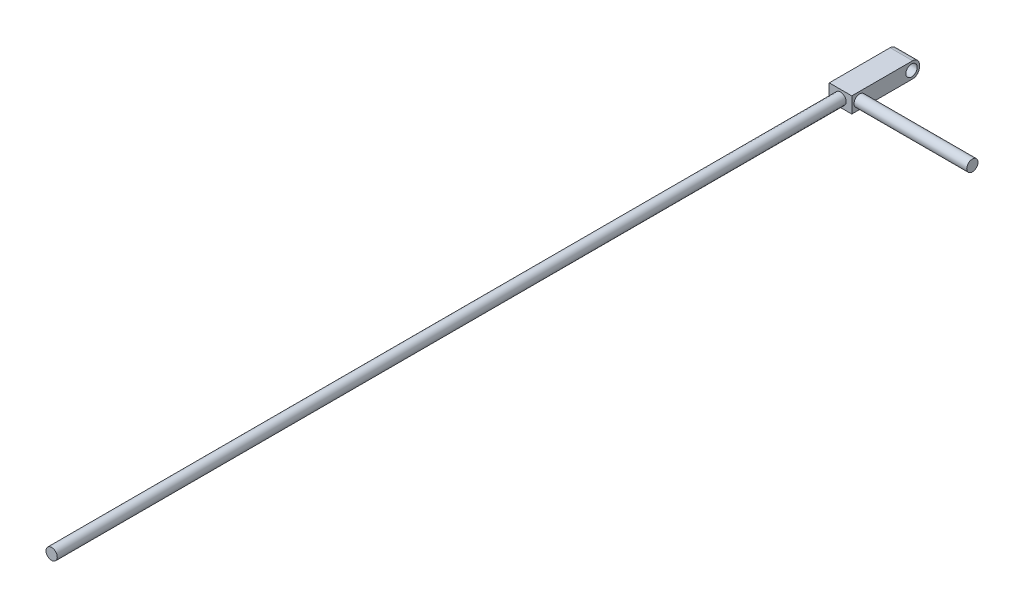
ISO-10303-21;
HEADER;
FILE_DESCRIPTION(('STEP AP214'),'2;1');
FILE_NAME('part.step','',(''),(''),'','','');
FILE_SCHEMA(('AUTOMOTIVE_DESIGN { 1 0 10303 214 1 1 1 1 }'));
ENDSEC;
DATA;
#1=APPLICATION_CONTEXT('core data for automotive mechanical design processes');
#2=APPLICATION_PROTOCOL_DEFINITION('international standard','automotive_design',2000,#1);
#3=PRODUCT_CONTEXT('',#1,'mechanical');
#4=PRODUCT('Part','Part','',(#3));
#5=PRODUCT_RELATED_PRODUCT_CATEGORY('part','',(#4));
#6=PRODUCT_DEFINITION_FORMATION('','',#4);
#7=PRODUCT_DEFINITION_CONTEXT('part definition',#1,'design');
#8=PRODUCT_DEFINITION('design','',#6,#7);
#9=PRODUCT_DEFINITION_SHAPE('','',#8);
#10=(LENGTH_UNIT() NAMED_UNIT(*) SI_UNIT(.MILLI.,.METRE.));
#11=(NAMED_UNIT(*) PLANE_ANGLE_UNIT() SI_UNIT($,.RADIAN.));
#12=(NAMED_UNIT(*) SI_UNIT($,.STERADIAN.) SOLID_ANGLE_UNIT());
#13=UNCERTAINTY_MEASURE_WITH_UNIT(LENGTH_MEASURE(1.E-05),#10,'distance_accuracy_value','');
#14=(GEOMETRIC_REPRESENTATION_CONTEXT(3) GLOBAL_UNCERTAINTY_ASSIGNED_CONTEXT((#13)) GLOBAL_UNIT_ASSIGNED_CONTEXT((#10,
#11,#12)) REPRESENTATION_CONTEXT('',''));
#15=CARTESIAN_POINT('',(0.,0.,0.));
#16=DIRECTION('',(0.,0.,1.));
#17=DIRECTION('',(1.,0.,0.));
#18=AXIS2_PLACEMENT_3D('',#15,#16,#17);
#19=CARTESIAN_POINT('',(5.,3.5,30.));
#20=DIRECTION('',(-1.,0.,0.));
#21=DIRECTION('',(0.,0.,1.));
#22=AXIS2_PLACEMENT_3D('',#19,#20,#21);
#23=PLANE('',#22);
#24=CARTESIAN_POINT('',(5.,0.,26.5));
#25=DIRECTION('',(-1.,0.,0.));
#26=DIRECTION('',(0.,0.,1.));
#27=AXIS2_PLACEMENT_3D('',#24,#25,#26);
#28=CIRCLE('',#27,2.5);
#29=CARTESIAN_POINT('',(5.,0.,29.));
#30=VERTEX_POINT('',#29);
#31=EDGE_CURVE('E113',#30,#30,#28,.F.);
#32=ORIENTED_EDGE('',*,*,#31,.F.);
#33=EDGE_LOOP('',(#32));
#34=FACE_BOUND('',#33,.T.);
#35=CARTESIAN_POINT('',(5.,0.,3.5));
#36=DIRECTION('',(1.,0.,0.));
#37=DIRECTION('',(0.,1.,0.));
#38=AXIS2_PLACEMENT_3D('',#35,#36,#37);
#39=CIRCLE('',#38,2.5);
#40=CARTESIAN_POINT('',(5.,2.5,3.5));
#41=VERTEX_POINT('',#40);
#42=EDGE_CURVE('E125',#41,#41,#39,.T.);
#43=ORIENTED_EDGE('',*,*,#42,.F.);
#44=EDGE_LOOP('',(#43));
#45=FACE_BOUND('',#44,.T.);
#46=DIRECTION('',(0.,0.,-1.));
#47=VECTOR('',#46,1.);
#48=CARTESIAN_POINT('',(5.,-3.5,30.));
#49=LINE('',#48,#47);
#50=CARTESIAN_POINT('',(5.,-3.5,30.));
#51=VERTEX_POINT('',#50);
#52=CARTESIAN_POINT('',(5.,-3.5,3.));
#53=VERTEX_POINT('',#52);
#54=EDGE_CURVE('E142',#51,#53,#49,.T.);
#55=ORIENTED_EDGE('',*,*,#54,.T.);
#56=CARTESIAN_POINT('',(5.,-0.499999999999999,3.));
#57=DIRECTION('',(-1.,0.,0.));
#58=DIRECTION('',(0.,0.,1.));
#59=AXIS2_PLACEMENT_3D('',#56,#57,#58);
#60=CIRCLE('',#59,3.);
#61=CARTESIAN_POINT('',(5.,-0.499999999999997,0.));
#62=VERTEX_POINT('',#61);
#63=EDGE_CURVE('E130',#53,#62,#60,.F.);
#64=ORIENTED_EDGE('',*,*,#63,.T.);
#65=DIRECTION('',(0.,1.,0.));
#66=VECTOR('',#65,1.);
#67=CARTESIAN_POINT('',(5.,3.5,0.));
#68=LINE('',#67,#66);
#69=CARTESIAN_POINT('',(5.,0.500000000000001,0.));
#70=VERTEX_POINT('',#69);
#71=EDGE_CURVE('E124',#62,#70,#68,.T.);
#72=ORIENTED_EDGE('',*,*,#71,.T.);
#73=CARTESIAN_POINT('',(5.,0.5,3.));
#74=DIRECTION('',(-1.,0.,0.));
#75=DIRECTION('',(0.,0.,1.));
#76=AXIS2_PLACEMENT_3D('',#73,#74,#75);
#77=CIRCLE('',#76,3.);
#78=CARTESIAN_POINT('',(5.,3.5,3.));
#79=VERTEX_POINT('',#78);
#80=EDGE_CURVE('E112',#70,#79,#77,.F.);
#81=ORIENTED_EDGE('',*,*,#80,.T.);
#82=DIRECTION('',(0.,0.,-1.));
#83=VECTOR('',#82,1.);
#84=CARTESIAN_POINT('',(5.,3.5,30.));
#85=LINE('',#84,#83);
#86=CARTESIAN_POINT('',(5.,3.5,30.));
#87=VERTEX_POINT('',#86);
#88=EDGE_CURVE('E93',#87,#79,#85,.T.);
#89=ORIENTED_EDGE('',*,*,#88,.F.);
#90=DIRECTION('',(0.,1.,0.));
#91=VECTOR('',#90,1.);
#92=CARTESIAN_POINT('',(5.,3.5,30.));
#93=LINE('',#92,#91);
#94=EDGE_CURVE('E99',#51,#87,#93,.T.);
#95=ORIENTED_EDGE('',*,*,#94,.F.);
#96=EDGE_LOOP('',(#55,#64,#72,#81,#89,#95));
#97=FACE_BOUND('',#96,.T.);
#98=ADVANCED_FACE('F32',(#34,#45,#97),#23,.F.);
#99=CARTESIAN_POINT('',(-5.,3.5,30.));
#100=DIRECTION('',(0.,-1.,0.));
#101=DIRECTION('',(1.,0.,0.));
#102=AXIS2_PLACEMENT_3D('',#99,#100,#101);
#103=PLANE('',#102);
#104=ORIENTED_EDGE('',*,*,#88,.T.);
#105=DIRECTION('',(-1.,0.,0.));
#106=VECTOR('',#105,1.);
#107=CARTESIAN_POINT('',(-5.,3.5,3.));
#108=LINE('',#107,#106);
#109=CARTESIAN_POINT('',(-5.,3.5,3.));
#110=VERTEX_POINT('',#109);
#111=EDGE_CURVE('E36',#79,#110,#108,.T.);
#112=ORIENTED_EDGE('',*,*,#111,.T.);
#113=DIRECTION('',(0.,0.,-1.));
#114=VECTOR('',#113,1.);
#115=CARTESIAN_POINT('',(-5.,3.5,30.));
#116=LINE('',#115,#114);
#117=CARTESIAN_POINT('',(-5.,3.5,30.));
#118=VERTEX_POINT('',#117);
#119=EDGE_CURVE('E95',#118,#110,#116,.T.);
#120=ORIENTED_EDGE('',*,*,#119,.F.);
#121=DIRECTION('',(-1.,0.,0.));
#122=VECTOR('',#121,1.);
#123=CARTESIAN_POINT('',(-5.,3.5,30.));
#124=LINE('',#123,#122);
#125=EDGE_CURVE('E89',#87,#118,#124,.T.);
#126=ORIENTED_EDGE('',*,*,#125,.F.);
#127=EDGE_LOOP('',(#104,#112,#120,#126));
#128=FACE_BOUND('',#127,.T.);
#129=ADVANCED_FACE('F91',(#128),#103,.F.);
#130=CARTESIAN_POINT('',(-5.,3.5,30.));
#131=DIRECTION('',(1.,0.,0.));
#132=DIRECTION('',(0.,0.,-1.));
#133=AXIS2_PLACEMENT_3D('',#130,#131,#132);
#134=PLANE('',#133);
#135=CARTESIAN_POINT('',(-5.,0.,3.5));
#136=DIRECTION('',(1.,0.,0.));
#137=DIRECTION('',(0.,0.,-1.));
#138=AXIS2_PLACEMENT_3D('',#135,#136,#137);
#139=CIRCLE('',#138,2.5);
#140=CARTESIAN_POINT('',(-5.,0.,0.999999999999999));
#141=VERTEX_POINT('',#140);
#142=EDGE_CURVE('E122',#141,#141,#139,.T.);
#143=ORIENTED_EDGE('',*,*,#142,.T.);
#144=EDGE_LOOP('',(#143));
#145=FACE_BOUND('',#144,.T.);
#146=DIRECTION('',(0.,-1.,0.));
#147=VECTOR('',#146,1.);
#148=CARTESIAN_POINT('',(-5.,3.5,0.));
#149=LINE('',#148,#147);
#150=CARTESIAN_POINT('',(-5.,0.500000000000001,0.));
#151=VERTEX_POINT('',#150);
#152=CARTESIAN_POINT('',(-5.,-0.499999999999997,0.));
#153=VERTEX_POINT('',#152);
#154=EDGE_CURVE('E108',#151,#153,#149,.T.);
#155=ORIENTED_EDGE('',*,*,#154,.T.);
#156=CARTESIAN_POINT('',(-5.,-0.499999999999999,3.));
#157=DIRECTION('',(1.,0.,0.));
#158=DIRECTION('',(0.,0.,-1.));
#159=AXIS2_PLACEMENT_3D('',#156,#157,#158);
#160=CIRCLE('',#159,3.);
#161=CARTESIAN_POINT('',(-5.,-3.5,3.));
#162=VERTEX_POINT('',#161);
#163=EDGE_CURVE('E135',#153,#162,#160,.F.);
#164=ORIENTED_EDGE('',*,*,#163,.T.);
#165=DIRECTION('',(0.,0.,-1.));
#166=VECTOR('',#165,1.);
#167=CARTESIAN_POINT('',(-5.,-3.5,30.));
#168=LINE('',#167,#166);
#169=CARTESIAN_POINT('',(-5.,-3.5,30.));
#170=VERTEX_POINT('',#169);
#171=EDGE_CURVE('E118',#170,#162,#168,.T.);
#172=ORIENTED_EDGE('',*,*,#171,.F.);
#173=DIRECTION('',(0.,-1.,0.));
#174=VECTOR('',#173,1.);
#175=CARTESIAN_POINT('',(-5.,3.5,30.));
#176=LINE('',#175,#174);
#177=EDGE_CURVE('E98',#118,#170,#176,.T.);
#178=ORIENTED_EDGE('',*,*,#177,.F.);
#179=ORIENTED_EDGE('',*,*,#119,.T.);
#180=CARTESIAN_POINT('',(-5.,0.5,3.));
#181=DIRECTION('',(1.,0.,0.));
#182=DIRECTION('',(0.,0.,-1.));
#183=AXIS2_PLACEMENT_3D('',#180,#181,#182);
#184=CIRCLE('',#183,3.);
#185=EDGE_CURVE('E48',#110,#151,#184,.F.);
#186=ORIENTED_EDGE('',*,*,#185,.T.);
#187=EDGE_LOOP('',(#155,#164,#172,#178,#179,#186));
#188=FACE_BOUND('',#187,.T.);
#189=ADVANCED_FACE('F140',(#145,#188),#134,.F.);
#190=CARTESIAN_POINT('',(-5.,-3.5,30.));
#191=DIRECTION('',(0.,1.,0.));
#192=DIRECTION('',(0.,0.,1.));
#193=AXIS2_PLACEMENT_3D('',#190,#191,#192);
#194=PLANE('',#193);
#195=ORIENTED_EDGE('',*,*,#171,.T.);
#196=DIRECTION('',(1.,0.,0.));
#197=VECTOR('',#196,1.);
#198=CARTESIAN_POINT('',(-5.,-3.5,3.));
#199=LINE('',#198,#197);
#200=EDGE_CURVE('E116',#162,#53,#199,.T.);
#201=ORIENTED_EDGE('',*,*,#200,.T.);
#202=ORIENTED_EDGE('',*,*,#54,.F.);
#203=DIRECTION('',(1.,0.,0.));
#204=VECTOR('',#203,1.);
#205=CARTESIAN_POINT('',(-5.,-3.5,30.));
#206=LINE('',#205,#204);
#207=EDGE_CURVE('E104',#170,#51,#206,.T.);
#208=ORIENTED_EDGE('',*,*,#207,.F.);
#209=EDGE_LOOP('',(#195,#201,#202,#208));
#210=FACE_BOUND('',#209,.T.);
#211=ADVANCED_FACE('F149',(#210),#194,.F.);
#212=CARTESIAN_POINT('',(0.,0.,30.));
#213=DIRECTION('',(0.,0.,1.));
#214=DIRECTION('',(1.,0.,0.));
#215=AXIS2_PLACEMENT_3D('',#212,#213,#214);
#216=PLANE('',#215);
#217=CARTESIAN_POINT('',(0.,0.,30.));
#218=DIRECTION('',(0.,0.,1.));
#219=DIRECTION('',(1.,0.,0.));
#220=AXIS2_PLACEMENT_3D('',#217,#218,#219);
#221=CIRCLE('',#220,2.5);
#222=CARTESIAN_POINT('',(2.5,0.,30.));
#223=VERTEX_POINT('',#222);
#224=EDGE_CURVE('E11',#223,#223,#221,.T.);
#225=ORIENTED_EDGE('',*,*,#224,.F.);
#226=EDGE_LOOP('',(#225));
#227=FACE_BOUND('',#226,.T.);
#228=ORIENTED_EDGE('',*,*,#94,.T.);
#229=ORIENTED_EDGE('',*,*,#125,.T.);
#230=ORIENTED_EDGE('',*,*,#177,.T.);
#231=ORIENTED_EDGE('',*,*,#207,.T.);
#232=EDGE_LOOP('',(#228,#229,#230,#231));
#233=FACE_BOUND('',#232,.T.);
#234=ADVANCED_FACE('F102',(#227,#233),#216,.T.);
#235=CARTESIAN_POINT('',(0.,0.,0.));
#236=DIRECTION('',(0.,0.,1.));
#237=DIRECTION('',(1.,0.,0.));
#238=AXIS2_PLACEMENT_3D('',#235,#236,#237);
#239=PLANE('',#238);
#240=ORIENTED_EDGE('',*,*,#71,.F.);
#241=DIRECTION('',(1.,0.,0.));
#242=VECTOR('',#241,1.);
#243=CARTESIAN_POINT('',(0.,-0.499999999999999,0.));
#244=LINE('',#243,#242);
#245=EDGE_CURVE('E56',#62,#153,#244,.F.);
#246=ORIENTED_EDGE('',*,*,#245,.T.);
#247=ORIENTED_EDGE('',*,*,#154,.F.);
#248=DIRECTION('',(-1.,0.,0.));
#249=VECTOR('',#248,1.);
#250=CARTESIAN_POINT('',(0.,0.5,0.));
#251=LINE('',#250,#249);
#252=EDGE_CURVE('E132',#151,#70,#251,.F.);
#253=ORIENTED_EDGE('',*,*,#252,.T.);
#254=EDGE_LOOP('',(#240,#246,#247,#253));
#255=FACE_BOUND('',#254,.T.);
#256=ADVANCED_FACE('F152',(#255),#239,.F.);
#257=CARTESIAN_POINT('',(-15.,0.,3.5));
#258=DIRECTION('',(1.,0.,0.));
#259=DIRECTION('',(0.,1.,0.));
#260=AXIS2_PLACEMENT_3D('',#257,#258,#259);
#261=CYLINDRICAL_SURFACE('',#260,2.5);
#262=ORIENTED_EDGE('',*,*,#42,.T.);
#263=EDGE_LOOP('',(#262));
#264=FACE_BOUND('',#263,.T.);
#265=ORIENTED_EDGE('',*,*,#142,.F.);
#266=EDGE_LOOP('',(#265));
#267=FACE_BOUND('',#266,.T.);
#268=ADVANCED_FACE('F180',(#264,#267),#261,.F.);
#269=CARTESIAN_POINT('',(55.,0.,26.5));
#270=DIRECTION('',(-1.,0.,0.));
#271=DIRECTION('',(0.,-1.,0.));
#272=AXIS2_PLACEMENT_3D('',#269,#270,#271);
#273=CYLINDRICAL_SURFACE('',#272,2.5);
#274=CARTESIAN_POINT('',(55.,0.,26.5));
#275=DIRECTION('',(1.,0.,0.));
#276=DIRECTION('',(0.,1.,0.));
#277=AXIS2_PLACEMENT_3D('',#274,#275,#276);
#278=CIRCLE('',#277,2.5);
#279=CARTESIAN_POINT('',(55.,2.50000000000002,26.5));
#280=VERTEX_POINT('',#279);
#281=EDGE_CURVE('E201',#280,#280,#278,.T.);
#282=ORIENTED_EDGE('',*,*,#281,.F.);
#283=EDGE_LOOP('',(#282));
#284=FACE_BOUND('',#283,.T.);
#285=ORIENTED_EDGE('',*,*,#31,.T.);
#286=EDGE_LOOP('',(#285));
#287=FACE_BOUND('',#286,.T.);
#288=ADVANCED_FACE('F186',(#284,#287),#273,.T.);
#289=CARTESIAN_POINT('',(55.,0.,26.5));
#290=DIRECTION('',(1.,0.,0.));
#291=DIRECTION('',(0.,1.,0.));
#292=AXIS2_PLACEMENT_3D('',#289,#290,#291);
#293=PLANE('',#292);
#294=ORIENTED_EDGE('',*,*,#281,.T.);
#295=EDGE_LOOP('',(#294));
#296=FACE_BOUND('',#295,.T.);
#297=ADVANCED_FACE('F162',(#296),#293,.T.);
#298=CARTESIAN_POINT('',(-5.,-0.499999999999999,3.));
#299=DIRECTION('',(1.,0.,0.));
#300=DIRECTION('',(0.,0.,-1.));
#301=AXIS2_PLACEMENT_3D('',#298,#299,#300);
#302=CYLINDRICAL_SURFACE('',#301,3.);
#303=ORIENTED_EDGE('',*,*,#163,.F.);
#304=ORIENTED_EDGE('',*,*,#245,.F.);
#305=ORIENTED_EDGE('',*,*,#63,.F.);
#306=ORIENTED_EDGE('',*,*,#200,.F.);
#307=EDGE_LOOP('',(#303,#304,#305,#306));
#308=FACE_BOUND('',#307,.T.);
#309=ADVANCED_FACE('F151',(#308),#302,.T.);
#310=CARTESIAN_POINT('',(-5.,0.5,3.));
#311=DIRECTION('',(-1.,0.,0.));
#312=DIRECTION('',(0.,-1.,0.));
#313=AXIS2_PLACEMENT_3D('',#310,#311,#312);
#314=CYLINDRICAL_SURFACE('',#313,3.);
#315=ORIENTED_EDGE('',*,*,#80,.F.);
#316=ORIENTED_EDGE('',*,*,#252,.F.);
#317=ORIENTED_EDGE('',*,*,#185,.F.);
#318=ORIENTED_EDGE('',*,*,#111,.F.);
#319=EDGE_LOOP('',(#315,#316,#317,#318));
#320=FACE_BOUND('',#319,.T.);
#321=ADVANCED_FACE('F34',(#320),#314,.T.);
#322=CARTESIAN_POINT('',(0.,0.,380.));
#323=DIRECTION('',(0.,0.,-1.));
#324=DIRECTION('',(-1.,0.,0.));
#325=AXIS2_PLACEMENT_3D('',#322,#323,#324);
#326=CYLINDRICAL_SURFACE('',#325,2.5);
#327=CARTESIAN_POINT('',(0.,0.,380.));
#328=DIRECTION('',(0.,0.,1.));
#329=DIRECTION('',(1.,0.,0.));
#330=AXIS2_PLACEMENT_3D('',#327,#328,#329);
#331=CIRCLE('',#330,2.5);
#332=CARTESIAN_POINT('',(2.5,0.,380.));
#333=VERTEX_POINT('',#332);
#334=EDGE_CURVE('E200',#333,#333,#331,.T.);
#335=ORIENTED_EDGE('',*,*,#334,.F.);
#336=EDGE_LOOP('',(#335));
#337=FACE_BOUND('',#336,.T.);
#338=ORIENTED_EDGE('',*,*,#224,.T.);
#339=EDGE_LOOP('',(#338));
#340=FACE_BOUND('',#339,.T.);
#341=ADVANCED_FACE('F154',(#337,#340),#326,.T.);
#342=CARTESIAN_POINT('',(0.,0.,380.));
#343=DIRECTION('',(0.,0.,1.));
#344=DIRECTION('',(1.,0.,0.));
#345=AXIS2_PLACEMENT_3D('',#342,#343,#344);
#346=PLANE('',#345);
#347=ORIENTED_EDGE('',*,*,#334,.T.);
#348=EDGE_LOOP('',(#347));
#349=FACE_BOUND('',#348,.T.);
#350=ADVANCED_FACE('F159',(#349),#346,.T.);
#351=CLOSED_SHELL('',(#98,#129,#189,#211,#234,#256,#268,#288,#297,#309,#321,#341,#350));
#352=MANIFOLD_SOLID_BREP('B2',#351);
#353=ADVANCED_BREP_SHAPE_REPRESENTATION('',(#18,#352),#14);
#354=SHAPE_DEFINITION_REPRESENTATION(#9,#353);
ENDSEC;
END-ISO-10303-21;
